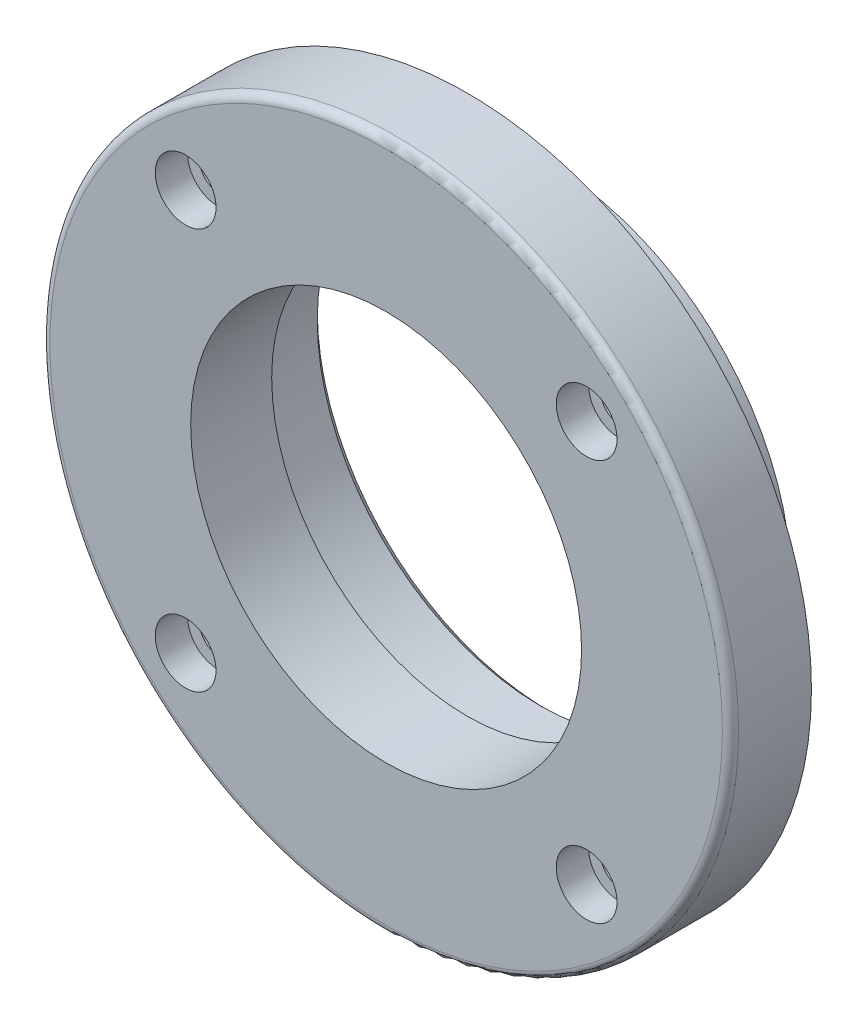
ISO-10303-21;
HEADER;
FILE_DESCRIPTION(('STEP AP214'),'2;1');
FILE_NAME('part.step','',(''),(''),'','','');
FILE_SCHEMA(('AUTOMOTIVE_DESIGN { 1 0 10303 214 1 1 1 1 }'));
ENDSEC;
DATA;
#1=APPLICATION_CONTEXT('core data for automotive mechanical design processes');
#2=APPLICATION_PROTOCOL_DEFINITION('international standard','automotive_design',2000,#1);
#3=PRODUCT_CONTEXT('',#1,'mechanical');
#4=PRODUCT('Part','Part','',(#3));
#5=PRODUCT_RELATED_PRODUCT_CATEGORY('part','',(#4));
#6=PRODUCT_DEFINITION_FORMATION('','',#4);
#7=PRODUCT_DEFINITION_CONTEXT('part definition',#1,'design');
#8=PRODUCT_DEFINITION('design','',#6,#7);
#9=PRODUCT_DEFINITION_SHAPE('','',#8);
#10=(LENGTH_UNIT() NAMED_UNIT(*) SI_UNIT(.MILLI.,.METRE.));
#11=(NAMED_UNIT(*) PLANE_ANGLE_UNIT() SI_UNIT($,.RADIAN.));
#12=(NAMED_UNIT(*) SI_UNIT($,.STERADIAN.) SOLID_ANGLE_UNIT());
#13=UNCERTAINTY_MEASURE_WITH_UNIT(LENGTH_MEASURE(1.E-05),#10,'distance_accuracy_value','');
#14=(GEOMETRIC_REPRESENTATION_CONTEXT(3) GLOBAL_UNCERTAINTY_ASSIGNED_CONTEXT((#13)) GLOBAL_UNIT_ASSIGNED_CONTEXT((#10,
#11,#12)) REPRESENTATION_CONTEXT('',''));
#15=CARTESIAN_POINT('',(0.,0.,0.));
#16=DIRECTION('',(0.,0.,1.));
#17=DIRECTION('',(1.,0.,0.));
#18=AXIS2_PLACEMENT_3D('',#15,#16,#17);
#19=CARTESIAN_POINT('',(0.,0.,0.));
#20=DIRECTION('',(0.,0.,1.));
#21=DIRECTION('',(1.,0.,0.));
#22=AXIS2_PLACEMENT_3D('',#19,#20,#21);
#23=PLANE('',#22);
#24=CARTESIAN_POINT('',(49.4974746830581,49.4974746830586,0.));
#25=DIRECTION('',(0.,0.,1.));
#26=DIRECTION('',(1.,0.,0.));
#27=AXIS2_PLACEMENT_3D('',#24,#25,#26);
#28=CIRCLE('',#27,4.5);
#29=CARTESIAN_POINT('',(53.9974746830581,49.4974746830586,0.));
#30=VERTEX_POINT('',#29);
#31=EDGE_CURVE('E38',#30,#30,#28,.T.);
#32=ORIENTED_EDGE('',*,*,#31,.T.);
#33=EDGE_LOOP('',(#32));
#34=FACE_BOUND('',#33,.T.);
#35=CARTESIAN_POINT('',(49.4974746830581,-49.4974746830586,0.));
#36=DIRECTION('',(0.,0.,1.));
#37=DIRECTION('',(1.,0.,0.));
#38=AXIS2_PLACEMENT_3D('',#35,#36,#37);
#39=CIRCLE('',#38,4.5);
#40=CARTESIAN_POINT('',(53.9974746830581,-49.4974746830586,0.));
#41=VERTEX_POINT('',#40);
#42=EDGE_CURVE('E60',#41,#41,#39,.T.);
#43=ORIENTED_EDGE('',*,*,#42,.T.);
#44=EDGE_LOOP('',(#43));
#45=FACE_BOUND('',#44,.T.);
#46=CARTESIAN_POINT('',(-49.4974746830584,-49.4974746830583,0.));
#47=DIRECTION('',(0.,0.,1.));
#48=DIRECTION('',(1.,0.,0.));
#49=AXIS2_PLACEMENT_3D('',#46,#47,#48);
#50=CIRCLE('',#49,4.5);
#51=CARTESIAN_POINT('',(-44.9974746830584,-49.4974746830583,0.));
#52=VERTEX_POINT('',#51);
#53=EDGE_CURVE('E56',#52,#52,#50,.T.);
#54=ORIENTED_EDGE('',*,*,#53,.T.);
#55=EDGE_LOOP('',(#54));
#56=FACE_BOUND('',#55,.T.);
#57=CARTESIAN_POINT('',(-49.4974746830581,49.4974746830586,0.));
#58=DIRECTION('',(0.,0.,1.));
#59=DIRECTION('',(1.,0.,0.));
#60=AXIS2_PLACEMENT_3D('',#57,#58,#59);
#61=CIRCLE('',#60,4.5);
#62=CARTESIAN_POINT('',(-44.9974746830581,49.4974746830586,0.));
#63=VERTEX_POINT('',#62);
#64=EDGE_CURVE('E51',#63,#63,#61,.T.);
#65=ORIENTED_EDGE('',*,*,#64,.T.);
#66=EDGE_LOOP('',(#65));
#67=FACE_BOUND('',#66,.T.);
#68=CARTESIAN_POINT('',(0.,0.,0.));
#69=DIRECTION('',(0.,0.,1.));
#70=DIRECTION('',(1.,0.,0.));
#71=AXIS2_PLACEMENT_3D('',#68,#69,#70);
#72=CIRCLE('',#71,85.);
#73=CARTESIAN_POINT('',(85.,0.,0.));
#74=VERTEX_POINT('',#73);
#75=EDGE_CURVE('E96',#74,#74,#72,.T.);
#76=ORIENTED_EDGE('',*,*,#75,.F.);
#77=EDGE_LOOP('',(#76));
#78=FACE_BOUND('',#77,.T.);
#79=CARTESIAN_POINT('',(0.,0.,0.));
#80=DIRECTION('',(0.,0.,1.));
#81=DIRECTION('',(1.,0.,0.));
#82=AXIS2_PLACEMENT_3D('',#79,#80,#81);
#83=CIRCLE('',#82,60.);
#84=CARTESIAN_POINT('',(60.,0.,0.));
#85=VERTEX_POINT('',#84);
#86=EDGE_CURVE('E104',#85,#85,#83,.F.);
#87=ORIENTED_EDGE('',*,*,#86,.F.);
#88=EDGE_LOOP('',(#87));
#89=FACE_BOUND('',#88,.T.);
#90=ADVANCED_FACE('F34',(#34,#45,#56,#67,#78,#89),#23,.F.);
#91=CARTESIAN_POINT('',(0.,0.,0.));
#92=DIRECTION('',(0.,0.,1.));
#93=DIRECTION('',(1.,0.,0.));
#94=AXIS2_PLACEMENT_3D('',#91,#92,#93);
#95=CIRCLE('',#94,48.25);
#96=CARTESIAN_POINT('',(48.25,0.,0.));
#97=VERTEX_POINT('',#96);
#98=EDGE_CURVE('E92',#97,#97,#95,.T.);
#99=ORIENTED_EDGE('',*,*,#98,.T.);
#100=EDGE_LOOP('',(#99));
#101=FACE_BOUND('',#100,.T.);
#102=CARTESIAN_POINT('',(0.,0.,0.));
#103=DIRECTION('',(0.,0.,1.));
#104=DIRECTION('',(1.,0.,0.));
#105=AXIS2_PLACEMENT_3D('',#102,#103,#104);
#106=CIRCLE('',#105,55.);
#107=CARTESIAN_POINT('',(55.,0.,0.));
#108=VERTEX_POINT('',#107);
#109=EDGE_CURVE('E101',#108,#108,#106,.T.);
#110=ORIENTED_EDGE('',*,*,#109,.F.);
#111=EDGE_LOOP('',(#110));
#112=FACE_BOUND('',#111,.T.);
#113=ADVANCED_FACE('F124',(#101,#112),#23,.F.);
#114=CARTESIAN_POINT('',(0.,0.,20.));
#115=DIRECTION('',(0.,0.,1.));
#116=DIRECTION('',(1.,0.,0.));
#117=AXIS2_PLACEMENT_3D('',#114,#115,#116);
#118=PLANE('',#117);
#119=CARTESIAN_POINT('',(49.4974746830581,49.4974746830586,20.));
#120=DIRECTION('',(0.,0.,1.));
#121=DIRECTION('',(1.,0.,0.));
#122=AXIS2_PLACEMENT_3D('',#119,#120,#121);
#123=CIRCLE('',#122,7.49999999999999);
#124=CARTESIAN_POINT('',(56.997474683058,49.4974746830586,20.));
#125=VERTEX_POINT('',#124);
#126=EDGE_CURVE('E322',#125,#125,#123,.T.);
#127=ORIENTED_EDGE('',*,*,#126,.F.);
#128=EDGE_LOOP('',(#127));
#129=FACE_BOUND('',#128,.T.);
#130=CARTESIAN_POINT('',(49.4974746830581,-49.4974746830586,20.));
#131=DIRECTION('',(0.,0.,1.));
#132=DIRECTION('',(1.,0.,0.));
#133=AXIS2_PLACEMENT_3D('',#130,#131,#132);
#134=CIRCLE('',#133,7.5);
#135=CARTESIAN_POINT('',(56.9974746830581,-49.4974746830586,20.));
#136=VERTEX_POINT('',#135);
#137=EDGE_CURVE('E75',#136,#136,#134,.T.);
#138=ORIENTED_EDGE('',*,*,#137,.F.);
#139=EDGE_LOOP('',(#138));
#140=FACE_BOUND('',#139,.T.);
#141=CARTESIAN_POINT('',(-49.4974746830584,-49.4974746830583,20.));
#142=DIRECTION('',(0.,0.,1.));
#143=DIRECTION('',(1.,0.,0.));
#144=AXIS2_PLACEMENT_3D('',#141,#142,#143);
#145=CIRCLE('',#144,7.49999999999999);
#146=CARTESIAN_POINT('',(-41.9974746830584,-49.4974746830583,20.));
#147=VERTEX_POINT('',#146);
#148=EDGE_CURVE('E62',#147,#147,#145,.T.);
#149=ORIENTED_EDGE('',*,*,#148,.F.);
#150=EDGE_LOOP('',(#149));
#151=FACE_BOUND('',#150,.T.);
#152=CARTESIAN_POINT('',(-49.4974746830581,49.4974746830586,20.));
#153=DIRECTION('',(0.,0.,1.));
#154=DIRECTION('',(1.,0.,0.));
#155=AXIS2_PLACEMENT_3D('',#152,#153,#154);
#156=CIRCLE('',#155,7.5);
#157=CARTESIAN_POINT('',(-41.9974746830581,49.4974746830586,20.));
#158=VERTEX_POINT('',#157);
#159=EDGE_CURVE('E58',#158,#158,#156,.T.);
#160=ORIENTED_EDGE('',*,*,#159,.F.);
#161=EDGE_LOOP('',(#160));
#162=FACE_BOUND('',#161,.T.);
#163=CARTESIAN_POINT('',(0.,0.,20.));
#164=DIRECTION('',(0.,0.,1.));
#165=DIRECTION('',(1.,0.,0.));
#166=AXIS2_PLACEMENT_3D('',#163,#164,#165);
#167=CIRCLE('',#166,83.);
#168=CARTESIAN_POINT('',(83.,0.,20.));
#169=VERTEX_POINT('',#168);
#170=EDGE_CURVE('E107',#169,#169,#167,.T.);
#171=ORIENTED_EDGE('',*,*,#170,.T.);
#172=EDGE_LOOP('',(#171));
#173=FACE_BOUND('',#172,.T.);
#174=CARTESIAN_POINT('',(0.,0.,20.));
#175=DIRECTION('',(0.,0.,1.));
#176=DIRECTION('',(1.,0.,0.));
#177=AXIS2_PLACEMENT_3D('',#174,#175,#176);
#178=CIRCLE('',#177,48.25);
#179=CARTESIAN_POINT('',(48.25,0.,20.));
#180=VERTEX_POINT('',#179);
#181=EDGE_CURVE('E93',#180,#180,#178,.T.);
#182=ORIENTED_EDGE('',*,*,#181,.F.);
#183=EDGE_LOOP('',(#182));
#184=FACE_BOUND('',#183,.T.);
#185=ADVANCED_FACE('F121',(#129,#140,#151,#162,#173,#184),#118,.T.);
#186=CARTESIAN_POINT('',(0.,0.,20.));
#187=DIRECTION('',(0.,0.,-1.));
#188=DIRECTION('',(-1.,0.,0.));
#189=AXIS2_PLACEMENT_3D('',#186,#187,#188);
#190=CYLINDRICAL_SURFACE('',#189,85.);
#191=CARTESIAN_POINT('',(0.,0.,18.));
#192=DIRECTION('',(0.,0.,1.));
#193=DIRECTION('',(1.,0.,0.));
#194=AXIS2_PLACEMENT_3D('',#191,#192,#193);
#195=CIRCLE('',#194,85.);
#196=CARTESIAN_POINT('',(85.,0.,18.));
#197=VERTEX_POINT('',#196);
#198=EDGE_CURVE('E47',#197,#197,#195,.F.);
#199=ORIENTED_EDGE('',*,*,#198,.T.);
#200=EDGE_LOOP('',(#199));
#201=FACE_BOUND('',#200,.T.);
#202=ORIENTED_EDGE('',*,*,#75,.T.);
#203=EDGE_LOOP('',(#202));
#204=FACE_BOUND('',#203,.T.);
#205=ADVANCED_FACE('F112',(#201,#204),#190,.T.);
#206=CARTESIAN_POINT('',(0.,0.,20.));
#207=DIRECTION('',(0.,0.,-1.));
#208=DIRECTION('',(-1.,0.,0.));
#209=AXIS2_PLACEMENT_3D('',#206,#207,#208);
#210=CYLINDRICAL_SURFACE('',#209,48.25);
#211=ORIENTED_EDGE('',*,*,#181,.T.);
#212=EDGE_LOOP('',(#211));
#213=FACE_BOUND('',#212,.T.);
#214=ORIENTED_EDGE('',*,*,#98,.F.);
#215=EDGE_LOOP('',(#214));
#216=FACE_BOUND('',#215,.T.);
#217=ADVANCED_FACE('F129',(#213,#216),#210,.F.);
#218=CARTESIAN_POINT('',(0.,0.,0.));
#219=DIRECTION('',(0.,0.,1.));
#220=DIRECTION('',(1.,0.,0.));
#221=AXIS2_PLACEMENT_3D('',#218,#219,#220);
#222=CYLINDRICAL_SURFACE('',#221,60.);
#223=ORIENTED_EDGE('',*,*,#86,.T.);
#224=EDGE_LOOP('',(#223));
#225=FACE_BOUND('',#224,.T.);
#226=CARTESIAN_POINT('',(0.,0.,-20.));
#227=DIRECTION('',(0.,0.,1.));
#228=DIRECTION('',(1.,0.,0.));
#229=AXIS2_PLACEMENT_3D('',#226,#227,#228);
#230=CIRCLE('',#229,60.);
#231=CARTESIAN_POINT('',(60.,0.,-20.));
#232=VERTEX_POINT('',#231);
#233=EDGE_CURVE('E54',#232,#232,#230,.T.);
#234=ORIENTED_EDGE('',*,*,#233,.T.);
#235=EDGE_LOOP('',(#234));
#236=FACE_BOUND('',#235,.T.);
#237=ADVANCED_FACE('F132',(#225,#236),#222,.T.);
#238=CARTESIAN_POINT('',(0.,60.,-20.));
#239=DIRECTION('',(0.,0.,1.));
#240=DIRECTION('',(1.,0.,0.));
#241=AXIS2_PLACEMENT_3D('',#238,#239,#240);
#242=PLANE('',#241);
#243=CARTESIAN_POINT('',(0.,0.,-20.));
#244=DIRECTION('',(0.,0.,1.));
#245=DIRECTION('',(1.,0.,0.));
#246=AXIS2_PLACEMENT_3D('',#243,#244,#245);
#247=CIRCLE('',#246,57.);
#248=CARTESIAN_POINT('',(57.,0.,-20.));
#249=VERTEX_POINT('',#248);
#250=EDGE_CURVE('E42',#249,#249,#247,.T.);
#251=ORIENTED_EDGE('',*,*,#250,.T.);
#252=EDGE_LOOP('',(#251));
#253=FACE_BOUND('',#252,.T.);
#254=ORIENTED_EDGE('',*,*,#233,.F.);
#255=EDGE_LOOP('',(#254));
#256=FACE_BOUND('',#255,.T.);
#257=ADVANCED_FACE('F142',(#253,#256),#242,.F.);
#258=CARTESIAN_POINT('',(0.,0.,0.));
#259=DIRECTION('',(0.,0.,1.));
#260=DIRECTION('',(1.,0.,0.));
#261=AXIS2_PLACEMENT_3D('',#258,#259,#260);
#262=CYLINDRICAL_SURFACE('',#261,55.);
#263=CARTESIAN_POINT('',(0.,0.,-18.));
#264=DIRECTION('',(0.,0.,1.));
#265=DIRECTION('',(1.,0.,0.));
#266=AXIS2_PLACEMENT_3D('',#263,#264,#265);
#267=CIRCLE('',#266,55.);
#268=CARTESIAN_POINT('',(55.,0.,-18.));
#269=VERTEX_POINT('',#268);
#270=EDGE_CURVE('E10',#269,#269,#267,.F.);
#271=ORIENTED_EDGE('',*,*,#270,.T.);
#272=EDGE_LOOP('',(#271));
#273=FACE_BOUND('',#272,.T.);
#274=ORIENTED_EDGE('',*,*,#109,.T.);
#275=EDGE_LOOP('',(#274));
#276=FACE_BOUND('',#275,.T.);
#277=ADVANCED_FACE('F118',(#273,#276),#262,.F.);
#278=CARTESIAN_POINT('',(0.,0.,18.));
#279=DIRECTION('',(0.,0.,1.));
#280=DIRECTION('',(1.,0.,0.));
#281=AXIS2_PLACEMENT_3D('',#278,#279,#280);
#282=TOROIDAL_SURFACE('',#281,83.,2.);
#283=ORIENTED_EDGE('',*,*,#198,.F.);
#284=EDGE_LOOP('',(#283));
#285=FACE_BOUND('',#284,.T.);
#286=ORIENTED_EDGE('',*,*,#170,.F.);
#287=EDGE_LOOP('',(#286));
#288=FACE_BOUND('',#287,.T.);
#289=ADVANCED_FACE('F115',(#285,#288),#282,.T.);
#290=CARTESIAN_POINT('',(0.,0.,-20.));
#291=DIRECTION('',(0.,0.,-1.));
#292=DIRECTION('',(-1.,0.,0.));
#293=AXIS2_PLACEMENT_3D('',#290,#291,#292);
#294=CONICAL_SURFACE('',#293,57.,0.785398163397443);
#295=ORIENTED_EDGE('',*,*,#270,.F.);
#296=EDGE_LOOP('',(#295));
#297=FACE_BOUND('',#296,.T.);
#298=ORIENTED_EDGE('',*,*,#250,.F.);
#299=EDGE_LOOP('',(#298));
#300=FACE_BOUND('',#299,.T.);
#301=ADVANCED_FACE('F36',(#297,#300),#294,.F.);
#302=CARTESIAN_POINT('',(-49.4974746830581,49.4974746830586,20.));
#303=DIRECTION('',(0.,0.,1.));
#304=DIRECTION('',(1.,0.,0.));
#305=AXIS2_PLACEMENT_3D('',#302,#303,#304);
#306=CYLINDRICAL_SURFACE('',#305,4.5);
#307=CARTESIAN_POINT('',(-49.4974746830581,49.4974746830586,12.));
#308=DIRECTION('',(0.,0.,1.));
#309=DIRECTION('',(1.,0.,0.));
#310=AXIS2_PLACEMENT_3D('',#307,#308,#309);
#311=CIRCLE('',#310,4.5);
#312=CARTESIAN_POINT('',(-44.9974746830581,49.4974746830586,12.));
#313=VERTEX_POINT('',#312);
#314=EDGE_CURVE('E55',#313,#313,#311,.T.);
#315=ORIENTED_EDGE('',*,*,#314,.T.);
#316=EDGE_LOOP('',(#315));
#317=FACE_BOUND('',#316,.T.);
#318=ORIENTED_EDGE('',*,*,#64,.F.);
#319=EDGE_LOOP('',(#318));
#320=FACE_BOUND('',#319,.T.);
#321=ADVANCED_FACE('F196',(#317,#320),#306,.F.);
#322=CARTESIAN_POINT('',(-44.9974746830581,49.4974746830586,12.));
#323=DIRECTION('',(0.,0.,-1.));
#324=DIRECTION('',(-1.,0.,0.));
#325=AXIS2_PLACEMENT_3D('',#322,#323,#324);
#326=PLANE('',#325);
#327=ORIENTED_EDGE('',*,*,#314,.F.);
#328=EDGE_LOOP('',(#327));
#329=FACE_BOUND('',#328,.T.);
#330=CARTESIAN_POINT('',(-49.4974746830581,49.4974746830586,12.));
#331=DIRECTION('',(0.,0.,1.));
#332=DIRECTION('',(1.,0.,0.));
#333=AXIS2_PLACEMENT_3D('',#330,#331,#332);
#334=CIRCLE('',#333,7.5);
#335=CARTESIAN_POINT('',(-41.9974746830581,49.4974746830586,12.));
#336=VERTEX_POINT('',#335);
#337=EDGE_CURVE('E85',#336,#336,#334,.T.);
#338=ORIENTED_EDGE('',*,*,#337,.T.);
#339=EDGE_LOOP('',(#338));
#340=FACE_BOUND('',#339,.T.);
#341=ADVANCED_FACE('F205',(#329,#340),#326,.F.);
#342=CARTESIAN_POINT('',(-49.4974746830581,49.4974746830586,20.));
#343=DIRECTION('',(0.,0.,1.));
#344=DIRECTION('',(1.,0.,0.));
#345=AXIS2_PLACEMENT_3D('',#342,#343,#344);
#346=CYLINDRICAL_SURFACE('',#345,7.5);
#347=ORIENTED_EDGE('',*,*,#337,.F.);
#348=EDGE_LOOP('',(#347));
#349=FACE_BOUND('',#348,.T.);
#350=ORIENTED_EDGE('',*,*,#159,.T.);
#351=EDGE_LOOP('',(#350));
#352=FACE_BOUND('',#351,.T.);
#353=ADVANCED_FACE('F213',(#349,#352),#346,.F.);
#354=CARTESIAN_POINT('',(-49.4974746830584,-49.4974746830583,20.));
#355=DIRECTION('',(0.,0.,1.));
#356=DIRECTION('',(1.,0.,0.));
#357=AXIS2_PLACEMENT_3D('',#354,#355,#356);
#358=CYLINDRICAL_SURFACE('',#357,4.5);
#359=CARTESIAN_POINT('',(-49.4974746830584,-49.4974746830583,12.));
#360=DIRECTION('',(0.,0.,1.));
#361=DIRECTION('',(1.,0.,0.));
#362=AXIS2_PLACEMENT_3D('',#359,#360,#361);
#363=CIRCLE('',#362,4.5);
#364=CARTESIAN_POINT('',(-44.9974746830584,-49.4974746830583,12.));
#365=VERTEX_POINT('',#364);
#366=EDGE_CURVE('E59',#365,#365,#363,.T.);
#367=ORIENTED_EDGE('',*,*,#366,.T.);
#368=EDGE_LOOP('',(#367));
#369=FACE_BOUND('',#368,.T.);
#370=ORIENTED_EDGE('',*,*,#53,.F.);
#371=EDGE_LOOP('',(#370));
#372=FACE_BOUND('',#371,.T.);
#373=ADVANCED_FACE('F222',(#369,#372),#358,.F.);
#374=CARTESIAN_POINT('',(-44.9974746830584,-49.4974746830583,12.));
#375=DIRECTION('',(0.,0.,-1.));
#376=DIRECTION('',(-1.,0.,0.));
#377=AXIS2_PLACEMENT_3D('',#374,#375,#376);
#378=PLANE('',#377);
#379=ORIENTED_EDGE('',*,*,#366,.F.);
#380=EDGE_LOOP('',(#379));
#381=FACE_BOUND('',#380,.T.);
#382=CARTESIAN_POINT('',(-49.4974746830584,-49.4974746830583,12.));
#383=DIRECTION('',(0.,0.,1.));
#384=DIRECTION('',(1.,0.,0.));
#385=AXIS2_PLACEMENT_3D('',#382,#383,#384);
#386=CIRCLE('',#385,7.5);
#387=CARTESIAN_POINT('',(-41.9974746830584,-49.4974746830583,12.));
#388=VERTEX_POINT('',#387);
#389=EDGE_CURVE('E67',#388,#388,#386,.T.);
#390=ORIENTED_EDGE('',*,*,#389,.T.);
#391=EDGE_LOOP('',(#390));
#392=FACE_BOUND('',#391,.T.);
#393=ADVANCED_FACE('F233',(#381,#392),#378,.F.);
#394=CARTESIAN_POINT('',(-49.4974746830584,-49.4974746830583,20.));
#395=DIRECTION('',(0.,0.,1.));
#396=DIRECTION('',(1.,0.,0.));
#397=AXIS2_PLACEMENT_3D('',#394,#395,#396);
#398=CYLINDRICAL_SURFACE('',#397,7.5);
#399=ORIENTED_EDGE('',*,*,#389,.F.);
#400=EDGE_LOOP('',(#399));
#401=FACE_BOUND('',#400,.T.);
#402=ORIENTED_EDGE('',*,*,#148,.T.);
#403=EDGE_LOOP('',(#402));
#404=FACE_BOUND('',#403,.T.);
#405=ADVANCED_FACE('F240',(#401,#404),#398,.F.);
#406=CARTESIAN_POINT('',(49.4974746830581,-49.4974746830586,20.));
#407=DIRECTION('',(0.,0.,1.));
#408=DIRECTION('',(1.,0.,0.));
#409=AXIS2_PLACEMENT_3D('',#406,#407,#408);
#410=CYLINDRICAL_SURFACE('',#409,4.5);
#411=CARTESIAN_POINT('',(49.4974746830581,-49.4974746830586,12.));
#412=DIRECTION('',(0.,0.,1.));
#413=DIRECTION('',(1.,0.,0.));
#414=AXIS2_PLACEMENT_3D('',#411,#412,#413);
#415=CIRCLE('',#414,4.5);
#416=CARTESIAN_POINT('',(53.9974746830581,-49.4974746830586,12.));
#417=VERTEX_POINT('',#416);
#418=EDGE_CURVE('E63',#417,#417,#415,.T.);
#419=ORIENTED_EDGE('',*,*,#418,.T.);
#420=EDGE_LOOP('',(#419));
#421=FACE_BOUND('',#420,.T.);
#422=ORIENTED_EDGE('',*,*,#42,.F.);
#423=EDGE_LOOP('',(#422));
#424=FACE_BOUND('',#423,.T.);
#425=ADVANCED_FACE('F248',(#421,#424),#410,.F.);
#426=CARTESIAN_POINT('',(53.9974746830581,-49.4974746830586,12.));
#427=DIRECTION('',(0.,0.,-1.));
#428=DIRECTION('',(-1.,0.,0.));
#429=AXIS2_PLACEMENT_3D('',#426,#427,#428);
#430=PLANE('',#429);
#431=ORIENTED_EDGE('',*,*,#418,.F.);
#432=EDGE_LOOP('',(#431));
#433=FACE_BOUND('',#432,.T.);
#434=CARTESIAN_POINT('',(49.4974746830581,-49.4974746830586,12.));
#435=DIRECTION('',(0.,0.,1.));
#436=DIRECTION('',(1.,0.,0.));
#437=AXIS2_PLACEMENT_3D('',#434,#435,#436);
#438=CIRCLE('',#437,7.5);
#439=CARTESIAN_POINT('',(56.9974746830581,-49.4974746830586,12.));
#440=VERTEX_POINT('',#439);
#441=EDGE_CURVE('E70',#440,#440,#438,.T.);
#442=ORIENTED_EDGE('',*,*,#441,.T.);
#443=EDGE_LOOP('',(#442));
#444=FACE_BOUND('',#443,.T.);
#445=ADVANCED_FACE('F256',(#433,#444),#430,.F.);
#446=CARTESIAN_POINT('',(49.4974746830581,-49.4974746830586,20.));
#447=DIRECTION('',(0.,0.,1.));
#448=DIRECTION('',(1.,0.,0.));
#449=AXIS2_PLACEMENT_3D('',#446,#447,#448);
#450=CYLINDRICAL_SURFACE('',#449,7.5);
#451=ORIENTED_EDGE('',*,*,#441,.F.);
#452=EDGE_LOOP('',(#451));
#453=FACE_BOUND('',#452,.T.);
#454=ORIENTED_EDGE('',*,*,#137,.T.);
#455=EDGE_LOOP('',(#454));
#456=FACE_BOUND('',#455,.T.);
#457=ADVANCED_FACE('F263',(#453,#456),#450,.F.);
#458=CARTESIAN_POINT('',(49.4974746830581,49.4974746830586,20.));
#459=DIRECTION('',(0.,0.,1.));
#460=DIRECTION('',(1.,0.,0.));
#461=AXIS2_PLACEMENT_3D('',#458,#459,#460);
#462=CYLINDRICAL_SURFACE('',#461,4.5);
#463=CARTESIAN_POINT('',(49.4974746830581,49.4974746830586,12.));
#464=DIRECTION('',(0.,0.,1.));
#465=DIRECTION('',(1.,0.,0.));
#466=AXIS2_PLACEMENT_3D('',#463,#464,#465);
#467=CIRCLE('',#466,4.5);
#468=CARTESIAN_POINT('',(53.9974746830581,49.4974746830586,12.));
#469=VERTEX_POINT('',#468);
#470=EDGE_CURVE('E324',#469,#469,#467,.T.);
#471=ORIENTED_EDGE('',*,*,#470,.T.);
#472=EDGE_LOOP('',(#471));
#473=FACE_BOUND('',#472,.T.);
#474=ORIENTED_EDGE('',*,*,#31,.F.);
#475=EDGE_LOOP('',(#474));
#476=FACE_BOUND('',#475,.T.);
#477=ADVANCED_FACE('F271',(#473,#476),#462,.F.);
#478=CARTESIAN_POINT('',(53.9974746830581,49.4974746830586,12.));
#479=DIRECTION('',(0.,0.,-1.));
#480=DIRECTION('',(-1.,0.,0.));
#481=AXIS2_PLACEMENT_3D('',#478,#479,#480);
#482=PLANE('',#481);
#483=ORIENTED_EDGE('',*,*,#470,.F.);
#484=EDGE_LOOP('',(#483));
#485=FACE_BOUND('',#484,.T.);
#486=CARTESIAN_POINT('',(49.4974746830581,49.4974746830586,12.));
#487=DIRECTION('',(0.,0.,1.));
#488=DIRECTION('',(1.,0.,0.));
#489=AXIS2_PLACEMENT_3D('',#486,#487,#488);
#490=CIRCLE('',#489,7.5);
#491=CARTESIAN_POINT('',(56.9974746830581,49.4974746830586,12.));
#492=VERTEX_POINT('',#491);
#493=EDGE_CURVE('E319',#492,#492,#490,.T.);
#494=ORIENTED_EDGE('',*,*,#493,.T.);
#495=EDGE_LOOP('',(#494));
#496=FACE_BOUND('',#495,.T.);
#497=ADVANCED_FACE('F279',(#485,#496),#482,.F.);
#498=CARTESIAN_POINT('',(49.4974746830581,49.4974746830586,20.));
#499=DIRECTION('',(0.,0.,1.));
#500=DIRECTION('',(1.,0.,0.));
#501=AXIS2_PLACEMENT_3D('',#498,#499,#500);
#502=CYLINDRICAL_SURFACE('',#501,7.5);
#503=ORIENTED_EDGE('',*,*,#493,.F.);
#504=EDGE_LOOP('',(#503));
#505=FACE_BOUND('',#504,.T.);
#506=ORIENTED_EDGE('',*,*,#126,.T.);
#507=EDGE_LOOP('',(#506));
#508=FACE_BOUND('',#507,.T.);
#509=ADVANCED_FACE('F287',(#505,#508),#502,.F.);
#510=CLOSED_SHELL('',(#90,#113,#185,#205,#217,#237,#257,#277,#289,#301,#321,#341,#353,#373,#393,
#405,#425,#445,#457,#477,#497,#509));
#511=MANIFOLD_SOLID_BREP('B2',#510);
#512=ADVANCED_BREP_SHAPE_REPRESENTATION('',(#18,#511),#14);
#513=SHAPE_DEFINITION_REPRESENTATION(#9,#512);
ENDSEC;
END-ISO-10303-21;
